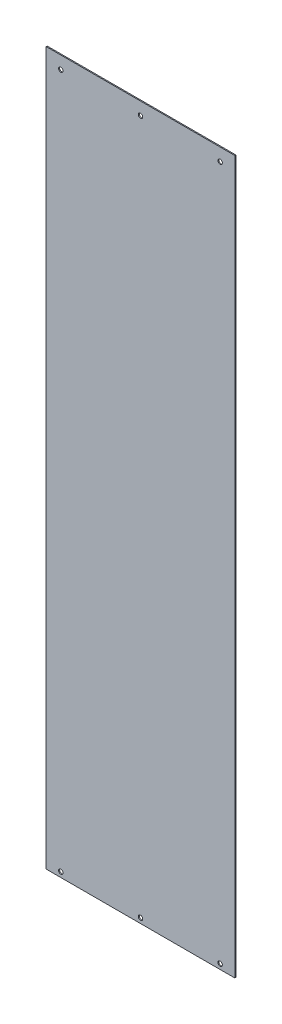
ISO-10303-21;
HEADER;
FILE_DESCRIPTION(('STEP AP214'),'2;1');
FILE_NAME('part.step','',(''),(''),'','','');
FILE_SCHEMA(('AUTOMOTIVE_DESIGN { 1 0 10303 214 1 1 1 1 }'));
ENDSEC;
DATA;
#1=APPLICATION_CONTEXT('core data for automotive mechanical design processes');
#2=APPLICATION_PROTOCOL_DEFINITION('international standard','automotive_design',2000,#1);
#3=PRODUCT_CONTEXT('',#1,'mechanical');
#4=PRODUCT('Part','Part','',(#3));
#5=PRODUCT_RELATED_PRODUCT_CATEGORY('part','',(#4));
#6=PRODUCT_DEFINITION_FORMATION('','',#4);
#7=PRODUCT_DEFINITION_CONTEXT('part definition',#1,'design');
#8=PRODUCT_DEFINITION('design','',#6,#7);
#9=PRODUCT_DEFINITION_SHAPE('','',#8);
#10=(LENGTH_UNIT() NAMED_UNIT(*) SI_UNIT(.MILLI.,.METRE.));
#11=(NAMED_UNIT(*) PLANE_ANGLE_UNIT() SI_UNIT($,.RADIAN.));
#12=(NAMED_UNIT(*) SI_UNIT($,.STERADIAN.) SOLID_ANGLE_UNIT());
#13=UNCERTAINTY_MEASURE_WITH_UNIT(LENGTH_MEASURE(1.E-05),#10,'distance_accuracy_value','');
#14=(GEOMETRIC_REPRESENTATION_CONTEXT(3) GLOBAL_UNCERTAINTY_ASSIGNED_CONTEXT((#13)) GLOBAL_UNIT_ASSIGNED_CONTEXT((#10,
#11,#12)) REPRESENTATION_CONTEXT('',''));
#15=CARTESIAN_POINT('',(0.,0.,0.));
#16=DIRECTION('',(0.,0.,1.));
#17=DIRECTION('',(1.,0.,0.));
#18=AXIS2_PLACEMENT_3D('',#15,#16,#17);
#19=CARTESIAN_POINT('',(-148.,0.,1.6));
#20=DIRECTION('',(1.,0.,0.));
#21=DIRECTION('',(0.,0.,-1.));
#22=AXIS2_PLACEMENT_3D('',#19,#20,#21);
#23=PLANE('',#22);
#24=DIRECTION('',(0.,-1.,0.));
#25=VECTOR('',#24,1.);
#26=CARTESIAN_POINT('',(-148.,0.,0.));
#27=LINE('',#26,#25);
#28=CARTESIAN_POINT('',(-148.,1118.,0.));
#29=VERTEX_POINT('',#28);
#30=CARTESIAN_POINT('',(-148.,0.,0.));
#31=VERTEX_POINT('',#30);
#32=EDGE_CURVE('E97',#29,#31,#27,.T.);
#33=ORIENTED_EDGE('',*,*,#32,.T.);
#34=DIRECTION('',(0.,0.,-1.));
#35=VECTOR('',#34,1.);
#36=CARTESIAN_POINT('',(-148.,0.,1.6));
#37=LINE('',#36,#35);
#38=CARTESIAN_POINT('',(-148.,0.,1.6));
#39=VERTEX_POINT('',#38);
#40=EDGE_CURVE('E11',#39,#31,#37,.T.);
#41=ORIENTED_EDGE('',*,*,#40,.F.);
#42=DIRECTION('',(0.,-1.,0.));
#43=VECTOR('',#42,1.);
#44=CARTESIAN_POINT('',(-148.,0.,1.6));
#45=LINE('',#44,#43);
#46=CARTESIAN_POINT('',(-148.,1118.,1.6));
#47=VERTEX_POINT('',#46);
#48=EDGE_CURVE('E85',#47,#39,#45,.T.);
#49=ORIENTED_EDGE('',*,*,#48,.F.);
#50=DIRECTION('',(0.,0.,-1.));
#51=VECTOR('',#50,1.);
#52=CARTESIAN_POINT('',(-148.,1118.,1.6));
#53=LINE('',#52,#51);
#54=EDGE_CURVE('E93',#47,#29,#53,.T.);
#55=ORIENTED_EDGE('',*,*,#54,.T.);
#56=EDGE_LOOP('',(#33,#41,#49,#55));
#57=FACE_BOUND('',#56,.T.);
#58=ADVANCED_FACE('F34',(#57),#23,.F.);
#59=CARTESIAN_POINT('',(-148.,0.,1.6));
#60=DIRECTION('',(0.,1.,0.));
#61=DIRECTION('',(0.,0.,1.));
#62=AXIS2_PLACEMENT_3D('',#59,#60,#61);
#63=PLANE('',#62);
#64=DIRECTION('',(1.,0.,0.));
#65=VECTOR('',#64,1.);
#66=CARTESIAN_POINT('',(-148.,0.,0.));
#67=LINE('',#66,#65);
#68=CARTESIAN_POINT('',(148.,0.,0.));
#69=VERTEX_POINT('',#68);
#70=EDGE_CURVE('E89',#31,#69,#67,.T.);
#71=ORIENTED_EDGE('',*,*,#70,.T.);
#72=DIRECTION('',(0.,0.,-1.));
#73=VECTOR('',#72,1.);
#74=CARTESIAN_POINT('',(148.,0.,1.6));
#75=LINE('',#74,#73);
#76=CARTESIAN_POINT('',(148.,0.,1.6));
#77=VERTEX_POINT('',#76);
#78=EDGE_CURVE('E42',#77,#69,#75,.T.);
#79=ORIENTED_EDGE('',*,*,#78,.F.);
#80=DIRECTION('',(1.,0.,0.));
#81=VECTOR('',#80,1.);
#82=CARTESIAN_POINT('',(-148.,0.,1.6));
#83=LINE('',#82,#81);
#84=EDGE_CURVE('E80',#39,#77,#83,.T.);
#85=ORIENTED_EDGE('',*,*,#84,.F.);
#86=ORIENTED_EDGE('',*,*,#40,.T.);
#87=EDGE_LOOP('',(#71,#79,#85,#86));
#88=FACE_BOUND('',#87,.T.);
#89=ADVANCED_FACE('F88',(#88),#63,.F.);
#90=CARTESIAN_POINT('',(148.,0.,1.6));
#91=DIRECTION('',(-1.,0.,0.));
#92=DIRECTION('',(0.,0.,1.));
#93=AXIS2_PLACEMENT_3D('',#90,#91,#92);
#94=PLANE('',#93);
#95=DIRECTION('',(0.,1.,0.));
#96=VECTOR('',#95,1.);
#97=CARTESIAN_POINT('',(148.,0.,0.));
#98=LINE('',#97,#96);
#99=CARTESIAN_POINT('',(148.,1118.,0.));
#100=VERTEX_POINT('',#99);
#101=EDGE_CURVE('E67',#69,#100,#98,.T.);
#102=ORIENTED_EDGE('',*,*,#101,.T.);
#103=DIRECTION('',(0.,0.,-1.));
#104=VECTOR('',#103,1.);
#105=CARTESIAN_POINT('',(148.,1118.,1.6));
#106=LINE('',#105,#104);
#107=CARTESIAN_POINT('',(148.,1118.,1.6));
#108=VERTEX_POINT('',#107);
#109=EDGE_CURVE('E90',#108,#100,#106,.T.);
#110=ORIENTED_EDGE('',*,*,#109,.F.);
#111=DIRECTION('',(0.,1.,0.));
#112=VECTOR('',#111,1.);
#113=CARTESIAN_POINT('',(148.,0.,1.6));
#114=LINE('',#113,#112);
#115=EDGE_CURVE('E83',#77,#108,#114,.T.);
#116=ORIENTED_EDGE('',*,*,#115,.F.);
#117=ORIENTED_EDGE('',*,*,#78,.T.);
#118=EDGE_LOOP('',(#102,#110,#116,#117));
#119=FACE_BOUND('',#118,.T.);
#120=ADVANCED_FACE('F91',(#119),#94,.F.);
#121=CARTESIAN_POINT('',(-148.,1118.,1.6));
#122=DIRECTION('',(0.,-1.,0.));
#123=DIRECTION('',(0.,0.,-1.));
#124=AXIS2_PLACEMENT_3D('',#121,#122,#123);
#125=PLANE('',#124);
#126=DIRECTION('',(-1.,0.,0.));
#127=VECTOR('',#126,1.);
#128=CARTESIAN_POINT('',(-148.,1118.,0.));
#129=LINE('',#128,#127);
#130=EDGE_CURVE('E73',#100,#29,#129,.T.);
#131=ORIENTED_EDGE('',*,*,#130,.T.);
#132=ORIENTED_EDGE('',*,*,#54,.F.);
#133=DIRECTION('',(-1.,0.,0.));
#134=VECTOR('',#133,1.);
#135=CARTESIAN_POINT('',(-148.,1118.,1.6));
#136=LINE('',#135,#134);
#137=EDGE_CURVE('E50',#108,#47,#136,.T.);
#138=ORIENTED_EDGE('',*,*,#137,.F.);
#139=ORIENTED_EDGE('',*,*,#109,.T.);
#140=EDGE_LOOP('',(#131,#132,#138,#139));
#141=FACE_BOUND('',#140,.T.);
#142=ADVANCED_FACE('F105',(#141),#125,.F.);
#143=CARTESIAN_POINT('',(-148.,1118.,1.6));
#144=DIRECTION('',(0.,0.,-1.));
#145=DIRECTION('',(-1.,0.,0.));
#146=AXIS2_PLACEMENT_3D('',#143,#144,#145);
#147=PLANE('',#146);
#148=CARTESIAN_POINT('',(-125.,1098.,1.6));
#149=DIRECTION('',(0.,0.,1.));
#150=DIRECTION('',(1.,0.,0.));
#151=AXIS2_PLACEMENT_3D('',#148,#149,#150);
#152=CIRCLE('',#151,3.49999999999999);
#153=CARTESIAN_POINT('',(-121.5,1098.,1.6));
#154=VERTEX_POINT('',#153);
#155=EDGE_CURVE('E143',#154,#154,#152,.T.);
#156=ORIENTED_EDGE('',*,*,#155,.F.);
#157=EDGE_LOOP('',(#156));
#158=FACE_BOUND('',#157,.T.);
#159=CARTESIAN_POINT('',(0.,1098.,1.6));
#160=DIRECTION('',(0.,0.,1.));
#161=DIRECTION('',(1.,0.,0.));
#162=AXIS2_PLACEMENT_3D('',#159,#160,#161);
#163=CIRCLE('',#162,3.49999999999999);
#164=CARTESIAN_POINT('',(3.49999999999999,1098.,1.6));
#165=VERTEX_POINT('',#164);
#166=EDGE_CURVE('E137',#165,#165,#163,.T.);
#167=ORIENTED_EDGE('',*,*,#166,.F.);
#168=EDGE_LOOP('',(#167));
#169=FACE_BOUND('',#168,.T.);
#170=CARTESIAN_POINT('',(125.,1098.,1.6));
#171=DIRECTION('',(0.,0.,1.));
#172=DIRECTION('',(1.,0.,0.));
#173=AXIS2_PLACEMENT_3D('',#170,#171,#172);
#174=CIRCLE('',#173,3.49999999999998);
#175=CARTESIAN_POINT('',(128.5,1098.,1.6));
#176=VERTEX_POINT('',#175);
#177=EDGE_CURVE('E131',#176,#176,#174,.T.);
#178=ORIENTED_EDGE('',*,*,#177,.F.);
#179=EDGE_LOOP('',(#178));
#180=FACE_BOUND('',#179,.T.);
#181=CARTESIAN_POINT('',(-125.,8.,1.6));
#182=DIRECTION('',(0.,0.,1.));
#183=DIRECTION('',(1.,0.,0.));
#184=AXIS2_PLACEMENT_3D('',#181,#182,#183);
#185=CIRCLE('',#184,3.49999999999999);
#186=CARTESIAN_POINT('',(-121.5,8.,1.6));
#187=VERTEX_POINT('',#186);
#188=EDGE_CURVE('E125',#187,#187,#185,.T.);
#189=ORIENTED_EDGE('',*,*,#188,.F.);
#190=EDGE_LOOP('',(#189));
#191=FACE_BOUND('',#190,.T.);
#192=CARTESIAN_POINT('',(0.,8.,1.6));
#193=DIRECTION('',(0.,0.,1.));
#194=DIRECTION('',(1.,0.,0.));
#195=AXIS2_PLACEMENT_3D('',#192,#193,#194);
#196=CIRCLE('',#195,3.49999999999999);
#197=CARTESIAN_POINT('',(3.49999999999999,8.,1.6));
#198=VERTEX_POINT('',#197);
#199=EDGE_CURVE('E119',#198,#198,#196,.T.);
#200=ORIENTED_EDGE('',*,*,#199,.F.);
#201=EDGE_LOOP('',(#200));
#202=FACE_BOUND('',#201,.T.);
#203=CARTESIAN_POINT('',(125.,8.,1.6));
#204=DIRECTION('',(0.,0.,1.));
#205=DIRECTION('',(1.,0.,0.));
#206=AXIS2_PLACEMENT_3D('',#203,#204,#205);
#207=CIRCLE('',#206,3.49999999999998);
#208=CARTESIAN_POINT('',(128.5,8.,1.6));
#209=VERTEX_POINT('',#208);
#210=EDGE_CURVE('E113',#209,#209,#207,.T.);
#211=ORIENTED_EDGE('',*,*,#210,.F.);
#212=EDGE_LOOP('',(#211));
#213=FACE_BOUND('',#212,.T.);
#214=ORIENTED_EDGE('',*,*,#48,.T.);
#215=ORIENTED_EDGE('',*,*,#84,.T.);
#216=ORIENTED_EDGE('',*,*,#115,.T.);
#217=ORIENTED_EDGE('',*,*,#137,.T.);
#218=EDGE_LOOP('',(#214,#215,#216,#217));
#219=FACE_BOUND('',#218,.T.);
#220=ADVANCED_FACE('F81',(#158,#169,#180,#191,#202,#213,#219),#147,.F.);
#221=CARTESIAN_POINT('',(-148.,1118.,0.));
#222=DIRECTION('',(0.,0.,-1.));
#223=DIRECTION('',(-1.,0.,0.));
#224=AXIS2_PLACEMENT_3D('',#221,#222,#223);
#225=PLANE('',#224);
#226=CARTESIAN_POINT('',(-125.,1098.,0.));
#227=DIRECTION('',(0.,0.,1.));
#228=DIRECTION('',(1.,0.,0.));
#229=AXIS2_PLACEMENT_3D('',#226,#227,#228);
#230=CIRCLE('',#229,3.5);
#231=CARTESIAN_POINT('',(-121.5,1098.,0.));
#232=VERTEX_POINT('',#231);
#233=EDGE_CURVE('E140',#232,#232,#230,.T.);
#234=ORIENTED_EDGE('',*,*,#233,.T.);
#235=EDGE_LOOP('',(#234));
#236=FACE_BOUND('',#235,.T.);
#237=CARTESIAN_POINT('',(0.,1098.,0.));
#238=DIRECTION('',(0.,0.,1.));
#239=DIRECTION('',(1.,0.,0.));
#240=AXIS2_PLACEMENT_3D('',#237,#238,#239);
#241=CIRCLE('',#240,3.5);
#242=CARTESIAN_POINT('',(3.5,1098.,0.));
#243=VERTEX_POINT('',#242);
#244=EDGE_CURVE('E134',#243,#243,#241,.T.);
#245=ORIENTED_EDGE('',*,*,#244,.T.);
#246=EDGE_LOOP('',(#245));
#247=FACE_BOUND('',#246,.T.);
#248=CARTESIAN_POINT('',(125.,1098.,0.));
#249=DIRECTION('',(0.,0.,1.));
#250=DIRECTION('',(1.,0.,0.));
#251=AXIS2_PLACEMENT_3D('',#248,#249,#250);
#252=CIRCLE('',#251,3.5);
#253=CARTESIAN_POINT('',(128.5,1098.,0.));
#254=VERTEX_POINT('',#253);
#255=EDGE_CURVE('E128',#254,#254,#252,.T.);
#256=ORIENTED_EDGE('',*,*,#255,.T.);
#257=EDGE_LOOP('',(#256));
#258=FACE_BOUND('',#257,.T.);
#259=CARTESIAN_POINT('',(-125.,8.,0.));
#260=DIRECTION('',(0.,0.,1.));
#261=DIRECTION('',(1.,0.,0.));
#262=AXIS2_PLACEMENT_3D('',#259,#260,#261);
#263=CIRCLE('',#262,3.5);
#264=CARTESIAN_POINT('',(-121.5,8.,0.));
#265=VERTEX_POINT('',#264);
#266=EDGE_CURVE('E122',#265,#265,#263,.T.);
#267=ORIENTED_EDGE('',*,*,#266,.T.);
#268=EDGE_LOOP('',(#267));
#269=FACE_BOUND('',#268,.T.);
#270=CARTESIAN_POINT('',(0.,8.,0.));
#271=DIRECTION('',(0.,0.,1.));
#272=DIRECTION('',(1.,0.,0.));
#273=AXIS2_PLACEMENT_3D('',#270,#271,#272);
#274=CIRCLE('',#273,3.5);
#275=CARTESIAN_POINT('',(3.5,8.,0.));
#276=VERTEX_POINT('',#275);
#277=EDGE_CURVE('E116',#276,#276,#274,.T.);
#278=ORIENTED_EDGE('',*,*,#277,.T.);
#279=EDGE_LOOP('',(#278));
#280=FACE_BOUND('',#279,.T.);
#281=CARTESIAN_POINT('',(125.,8.,0.));
#282=DIRECTION('',(0.,0.,1.));
#283=DIRECTION('',(1.,0.,0.));
#284=AXIS2_PLACEMENT_3D('',#281,#282,#283);
#285=CIRCLE('',#284,3.5);
#286=CARTESIAN_POINT('',(128.5,8.,0.));
#287=VERTEX_POINT('',#286);
#288=EDGE_CURVE('E100',#287,#287,#285,.T.);
#289=ORIENTED_EDGE('',*,*,#288,.T.);
#290=EDGE_LOOP('',(#289));
#291=FACE_BOUND('',#290,.T.);
#292=ORIENTED_EDGE('',*,*,#32,.F.);
#293=ORIENTED_EDGE('',*,*,#130,.F.);
#294=ORIENTED_EDGE('',*,*,#101,.F.);
#295=ORIENTED_EDGE('',*,*,#70,.F.);
#296=EDGE_LOOP('',(#292,#293,#294,#295));
#297=FACE_BOUND('',#296,.T.);
#298=ADVANCED_FACE('F108',(#236,#247,#258,#269,#280,#291,#297),#225,.T.);
#299=CARTESIAN_POINT('',(125.,8.,1.6));
#300=DIRECTION('',(0.,0.,1.));
#301=DIRECTION('',(1.,0.,0.));
#302=AXIS2_PLACEMENT_3D('',#299,#300,#301);
#303=CYLINDRICAL_SURFACE('',#302,3.49999999999999);
#304=ORIENTED_EDGE('',*,*,#288,.F.);
#305=EDGE_LOOP('',(#304));
#306=FACE_BOUND('',#305,.T.);
#307=ORIENTED_EDGE('',*,*,#210,.T.);
#308=EDGE_LOOP('',(#307));
#309=FACE_BOUND('',#308,.T.);
#310=ADVANCED_FACE('F162',(#306,#309),#303,.F.);
#311=CARTESIAN_POINT('',(0.,8.,1.6));
#312=DIRECTION('',(0.,0.,1.));
#313=DIRECTION('',(1.,0.,0.));
#314=AXIS2_PLACEMENT_3D('',#311,#312,#313);
#315=CYLINDRICAL_SURFACE('',#314,3.49999999999999);
#316=ORIENTED_EDGE('',*,*,#277,.F.);
#317=EDGE_LOOP('',(#316));
#318=FACE_BOUND('',#317,.T.);
#319=ORIENTED_EDGE('',*,*,#199,.T.);
#320=EDGE_LOOP('',(#319));
#321=FACE_BOUND('',#320,.T.);
#322=ADVANCED_FACE('F164',(#318,#321),#315,.F.);
#323=CARTESIAN_POINT('',(-125.,8.,1.6));
#324=DIRECTION('',(0.,0.,1.));
#325=DIRECTION('',(1.,0.,0.));
#326=AXIS2_PLACEMENT_3D('',#323,#324,#325);
#327=CYLINDRICAL_SURFACE('',#326,3.5);
#328=ORIENTED_EDGE('',*,*,#266,.F.);
#329=EDGE_LOOP('',(#328));
#330=FACE_BOUND('',#329,.T.);
#331=ORIENTED_EDGE('',*,*,#188,.T.);
#332=EDGE_LOOP('',(#331));
#333=FACE_BOUND('',#332,.T.);
#334=ADVANCED_FACE('F171',(#330,#333),#327,.F.);
#335=CARTESIAN_POINT('',(125.,1098.,1.6));
#336=DIRECTION('',(0.,0.,1.));
#337=DIRECTION('',(1.,0.,0.));
#338=AXIS2_PLACEMENT_3D('',#335,#336,#337);
#339=CYLINDRICAL_SURFACE('',#338,3.49999999999999);
#340=ORIENTED_EDGE('',*,*,#255,.F.);
#341=EDGE_LOOP('',(#340));
#342=FACE_BOUND('',#341,.T.);
#343=ORIENTED_EDGE('',*,*,#177,.T.);
#344=EDGE_LOOP('',(#343));
#345=FACE_BOUND('',#344,.T.);
#346=ADVANCED_FACE('F206',(#342,#345),#339,.F.);
#347=CARTESIAN_POINT('',(0.,1098.,1.6));
#348=DIRECTION('',(0.,0.,1.));
#349=DIRECTION('',(1.,0.,0.));
#350=AXIS2_PLACEMENT_3D('',#347,#348,#349);
#351=CYLINDRICAL_SURFACE('',#350,3.49999999999999);
#352=ORIENTED_EDGE('',*,*,#244,.F.);
#353=EDGE_LOOP('',(#352));
#354=FACE_BOUND('',#353,.T.);
#355=ORIENTED_EDGE('',*,*,#166,.T.);
#356=EDGE_LOOP('',(#355));
#357=FACE_BOUND('',#356,.T.);
#358=ADVANCED_FACE('F212',(#354,#357),#351,.F.);
#359=CARTESIAN_POINT('',(-125.,1098.,1.6));
#360=DIRECTION('',(0.,0.,1.));
#361=DIRECTION('',(1.,0.,0.));
#362=AXIS2_PLACEMENT_3D('',#359,#360,#361);
#363=CYLINDRICAL_SURFACE('',#362,3.5);
#364=ORIENTED_EDGE('',*,*,#233,.F.);
#365=EDGE_LOOP('',(#364));
#366=FACE_BOUND('',#365,.T.);
#367=ORIENTED_EDGE('',*,*,#155,.T.);
#368=EDGE_LOOP('',(#367));
#369=FACE_BOUND('',#368,.T.);
#370=ADVANCED_FACE('F147',(#366,#369),#363,.F.);
#371=CLOSED_SHELL('',(#58,#89,#120,#142,#220,#298,#310,#322,#334,#346,#358,#370));
#372=MANIFOLD_SOLID_BREP('B2',#371);
#373=ADVANCED_BREP_SHAPE_REPRESENTATION('',(#18,#372),#14);
#374=SHAPE_DEFINITION_REPRESENTATION(#9,#373);
ENDSEC;
END-ISO-10303-21;
